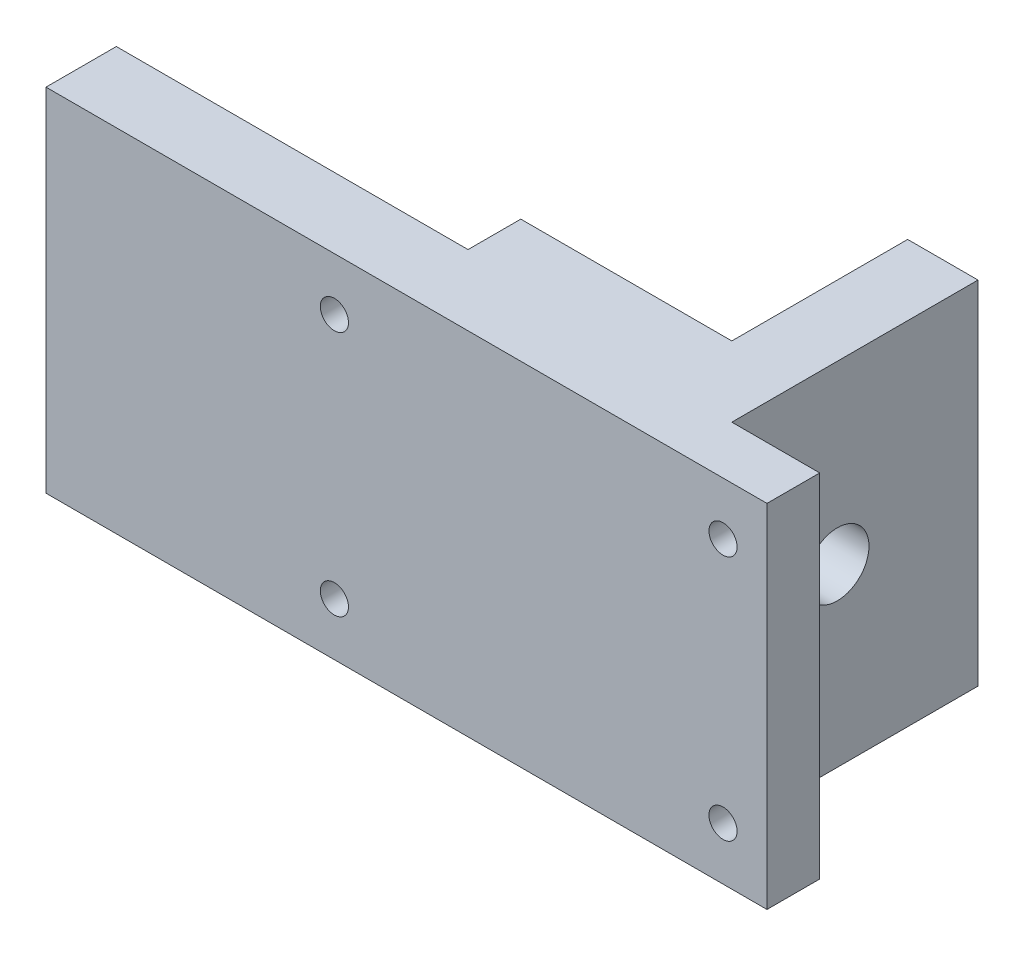
ISO-10303-21;
HEADER;
FILE_DESCRIPTION(('STEP AP214'),'2;1');
FILE_NAME('part.step','',(''),(''),'','','');
FILE_SCHEMA(('AUTOMOTIVE_DESIGN { 1 0 10303 214 1 1 1 1 }'));
ENDSEC;
DATA;
#1=APPLICATION_CONTEXT('core data for automotive mechanical design processes');
#2=APPLICATION_PROTOCOL_DEFINITION('international standard','automotive_design',2000,#1);
#3=PRODUCT_CONTEXT('',#1,'mechanical');
#4=PRODUCT('Part','Part','',(#3));
#5=PRODUCT_RELATED_PRODUCT_CATEGORY('part','',(#4));
#6=PRODUCT_DEFINITION_FORMATION('','',#4);
#7=PRODUCT_DEFINITION_CONTEXT('part definition',#1,'design');
#8=PRODUCT_DEFINITION('design','',#6,#7);
#9=PRODUCT_DEFINITION_SHAPE('','',#8);
#10=(LENGTH_UNIT() NAMED_UNIT(*) SI_UNIT(.MILLI.,.METRE.));
#11=(NAMED_UNIT(*) PLANE_ANGLE_UNIT() SI_UNIT($,.RADIAN.));
#12=(NAMED_UNIT(*) SI_UNIT($,.STERADIAN.) SOLID_ANGLE_UNIT());
#13=UNCERTAINTY_MEASURE_WITH_UNIT(LENGTH_MEASURE(1.E-05),#10,'distance_accuracy_value','');
#14=(GEOMETRIC_REPRESENTATION_CONTEXT(3) GLOBAL_UNCERTAINTY_ASSIGNED_CONTEXT((#13)) GLOBAL_UNIT_ASSIGNED_CONTEXT((#10,
#11,#12)) REPRESENTATION_CONTEXT('',''));
#15=CARTESIAN_POINT('',(0.,0.,0.));
#16=DIRECTION('',(0.,0.,1.));
#17=DIRECTION('',(1.,0.,0.));
#18=AXIS2_PLACEMENT_3D('',#15,#16,#17);
#19=CARTESIAN_POINT('',(0.,100.,-20.));
#20=DIRECTION('',(0.,0.,1.));
#21=DIRECTION('',(1.,0.,0.));
#22=AXIS2_PLACEMENT_3D('',#19,#20,#21);
#23=PLANE('',#22);
#24=CARTESIAN_POINT('',(-137.5,67.,-20.));
#25=DIRECTION('',(0.,0.,-1.));
#26=DIRECTION('',(-1.,0.,0.));
#27=AXIS2_PLACEMENT_3D('',#24,#25,#26);
#28=CIRCLE('',#27,2.99999999999999);
#29=CARTESIAN_POINT('',(-140.5,67.,-20.));
#30=VERTEX_POINT('',#29);
#31=EDGE_CURVE('E412',#30,#30,#28,.T.);
#32=ORIENTED_EDGE('',*,*,#31,.F.);
#33=EDGE_LOOP('',(#32));
#34=FACE_BOUND('',#33,.T.);
#35=CARTESIAN_POINT('',(-137.5,33.,-20.));
#36=DIRECTION('',(0.,0.,-1.));
#37=DIRECTION('',(-1.,0.,0.));
#38=AXIS2_PLACEMENT_3D('',#35,#36,#37);
#39=CIRCLE('',#38,2.99999999999999);
#40=CARTESIAN_POINT('',(-140.5,33.,-20.));
#41=VERTEX_POINT('',#40);
#42=EDGE_CURVE('E404',#41,#41,#39,.T.);
#43=ORIENTED_EDGE('',*,*,#42,.F.);
#44=EDGE_LOOP('',(#43));
#45=FACE_BOUND('',#44,.T.);
#46=CARTESIAN_POINT('',(-78.,15.,-20.));
#47=DIRECTION('',(0.,0.,-1.));
#48=DIRECTION('',(-1.,0.,0.));
#49=AXIS2_PLACEMENT_3D('',#46,#47,#48);
#50=CIRCLE('',#49,7.49999999999999);
#51=CARTESIAN_POINT('',(-85.5,15.,-20.));
#52=VERTEX_POINT('',#51);
#53=EDGE_CURVE('E428',#52,#52,#50,.T.);
#54=ORIENTED_EDGE('',*,*,#53,.F.);
#55=EDGE_LOOP('',(#54));
#56=FACE_BOUND('',#55,.T.);
#57=DIRECTION('',(0.,1.,0.));
#58=VECTOR('',#57,1.);
#59=CARTESIAN_POINT('',(-60.,29.,-20.));
#60=LINE('',#59,#58);
#61=CARTESIAN_POINT('',(-60.,0.,-20.));
#62=VERTEX_POINT('',#61);
#63=CARTESIAN_POINT('',(-60.,29.,-20.));
#64=VERTEX_POINT('',#63);
#65=EDGE_CURVE('E158',#62,#64,#60,.T.);
#66=ORIENTED_EDGE('',*,*,#65,.F.);
#67=DIRECTION('',(-1.,0.,0.));
#68=VECTOR('',#67,1.);
#69=CARTESIAN_POINT('',(0.,0.,-20.));
#70=LINE('',#69,#68);
#71=CARTESIAN_POINT('',(-160.,0.,-20.));
#72=VERTEX_POINT('',#71);
#73=EDGE_CURVE('E145',#62,#72,#70,.T.);
#74=ORIENTED_EDGE('',*,*,#73,.T.);
#75=DIRECTION('',(0.,-1.,0.));
#76=VECTOR('',#75,1.);
#77=CARTESIAN_POINT('',(-160.,100.,-20.));
#78=LINE('',#77,#76);
#79=CARTESIAN_POINT('',(-160.,100.,-20.));
#80=VERTEX_POINT('',#79);
#81=EDGE_CURVE('E224',#80,#72,#78,.T.);
#82=ORIENTED_EDGE('',*,*,#81,.F.);
#83=DIRECTION('',(-1.,0.,0.));
#84=VECTOR('',#83,1.);
#85=CARTESIAN_POINT('',(0.,100.,-20.));
#86=LINE('',#85,#84);
#87=CARTESIAN_POINT('',(-60.,100.,-20.));
#88=VERTEX_POINT('',#87);
#89=EDGE_CURVE('E222',#88,#80,#86,.T.);
#90=ORIENTED_EDGE('',*,*,#89,.F.);
#91=DIRECTION('',(0.,1.,0.));
#92=VECTOR('',#91,1.);
#93=CARTESIAN_POINT('',(-60.,71.,-20.));
#94=LINE('',#93,#92);
#95=CARTESIAN_POINT('',(-60.,71.,-20.));
#96=VERTEX_POINT('',#95);
#97=EDGE_CURVE('E191',#96,#88,#94,.T.);
#98=ORIENTED_EDGE('',*,*,#97,.F.);
#99=DIRECTION('',(-1.,0.,0.));
#100=VECTOR('',#99,1.);
#101=CARTESIAN_POINT('',(-60.,71.,-20.));
#102=LINE('',#101,#100);
#103=CARTESIAN_POINT('',(0.,71.,-20.));
#104=VERTEX_POINT('',#103);
#105=EDGE_CURVE('E163',#104,#96,#102,.T.);
#106=ORIENTED_EDGE('',*,*,#105,.F.);
#107=DIRECTION('',(0.,-1.,0.));
#108=VECTOR('',#107,1.);
#109=CARTESIAN_POINT('',(0.,100.,-20.));
#110=LINE('',#109,#108);
#111=CARTESIAN_POINT('',(0.,29.,-20.));
#112=VERTEX_POINT('',#111);
#113=EDGE_CURVE('E238',#104,#112,#110,.T.);
#114=ORIENTED_EDGE('',*,*,#113,.T.);
#115=DIRECTION('',(1.,0.,0.));
#116=VECTOR('',#115,1.);
#117=CARTESIAN_POINT('',(-60.,29.,-20.));
#118=LINE('',#117,#116);
#119=EDGE_CURVE('E65',#64,#112,#118,.T.);
#120=ORIENTED_EDGE('',*,*,#119,.F.);
#121=EDGE_LOOP('',(#66,#74,#82,#90,#98,#106,#114,#120));
#122=FACE_BOUND('',#121,.T.);
#123=CARTESIAN_POINT('',(-78.,85.,-20.));
#124=DIRECTION('',(0.,0.,-1.));
#125=DIRECTION('',(-1.,0.,0.));
#126=AXIS2_PLACEMENT_3D('',#123,#124,#125);
#127=CIRCLE('',#126,7.49999999999999);
#128=CARTESIAN_POINT('',(-85.5,85.,-20.));
#129=VERTEX_POINT('',#128);
#130=EDGE_CURVE('E411',#129,#129,#127,.T.);
#131=ORIENTED_EDGE('',*,*,#130,.F.);
#132=EDGE_LOOP('',(#131));
#133=FACE_BOUND('',#132,.T.);
#134=ADVANCED_FACE('F42',(#34,#45,#56,#122,#133),#23,.F.);
#135=CARTESIAN_POINT('',(0.,100.,-85.));
#136=DIRECTION('',(1.,0.,0.));
#137=DIRECTION('',(0.,0.,-1.));
#138=AXIS2_PLACEMENT_3D('',#135,#136,#137);
#139=PLANE('',#138);
#140=CARTESIAN_POINT('',(0.,50.,-45.));
#141=DIRECTION('',(1.,0.,0.));
#142=DIRECTION('',(0.,0.,-1.));
#143=AXIS2_PLACEMENT_3D('',#140,#141,#142);
#144=CIRCLE('',#143,9.);
#145=CARTESIAN_POINT('',(0.,50.,-54.));
#146=VERTEX_POINT('',#145);
#147=EDGE_CURVE('E400',#146,#146,#144,.T.);
#148=ORIENTED_EDGE('',*,*,#147,.T.);
#149=EDGE_LOOP('',(#148));
#150=FACE_BOUND('',#149,.T.);
#151=DIRECTION('',(0.,0.,1.));
#152=VECTOR('',#151,1.);
#153=CARTESIAN_POINT('',(0.,29.,-35.));
#154=LINE('',#153,#152);
#155=CARTESIAN_POINT('',(0.,29.,-35.));
#156=VERTEX_POINT('',#155);
#157=EDGE_CURVE('E170',#156,#112,#154,.T.);
#158=ORIENTED_EDGE('',*,*,#157,.T.);
#159=ORIENTED_EDGE('',*,*,#113,.F.);
#160=DIRECTION('',(0.,0.,1.));
#161=VECTOR('',#160,1.);
#162=CARTESIAN_POINT('',(0.,71.,-35.));
#163=LINE('',#162,#161);
#164=CARTESIAN_POINT('',(0.,71.,-35.));
#165=VERTEX_POINT('',#164);
#166=EDGE_CURVE('E205',#165,#104,#163,.T.);
#167=ORIENTED_EDGE('',*,*,#166,.F.);
#168=DIRECTION('',(0.,-1.,0.));
#169=VECTOR('',#168,1.);
#170=CARTESIAN_POINT('',(0.,71.,-35.));
#171=LINE('',#170,#169);
#172=CARTESIAN_POINT('',(0.,100.,-35.));
#173=VERTEX_POINT('',#172);
#174=EDGE_CURVE('E187',#173,#165,#171,.T.);
#175=ORIENTED_EDGE('',*,*,#174,.F.);
#176=DIRECTION('',(0.,0.,1.));
#177=VECTOR('',#176,1.);
#178=CARTESIAN_POINT('',(0.,100.,-85.));
#179=LINE('',#178,#177);
#180=CARTESIAN_POINT('',(0.,100.,-85.));
#181=VERTEX_POINT('',#180);
#182=EDGE_CURVE('E219',#181,#173,#179,.T.);
#183=ORIENTED_EDGE('',*,*,#182,.F.);
#184=DIRECTION('',(0.,-1.,0.));
#185=VECTOR('',#184,1.);
#186=CARTESIAN_POINT('',(0.,100.,-85.));
#187=LINE('',#186,#185);
#188=CARTESIAN_POINT('',(0.,0.,-85.));
#189=VERTEX_POINT('',#188);
#190=EDGE_CURVE('E240',#181,#189,#187,.T.);
#191=ORIENTED_EDGE('',*,*,#190,.T.);
#192=DIRECTION('',(0.,0.,1.));
#193=VECTOR('',#192,1.);
#194=CARTESIAN_POINT('',(0.,0.,-85.));
#195=LINE('',#194,#193);
#196=CARTESIAN_POINT('',(0.,0.,-35.));
#197=VERTEX_POINT('',#196);
#198=EDGE_CURVE('E156',#189,#197,#195,.T.);
#199=ORIENTED_EDGE('',*,*,#198,.T.);
#200=DIRECTION('',(0.,-1.,0.));
#201=VECTOR('',#200,1.);
#202=CARTESIAN_POINT('',(0.,29.,-35.));
#203=LINE('',#202,#201);
#204=EDGE_CURVE('E57',#156,#197,#203,.T.);
#205=ORIENTED_EDGE('',*,*,#204,.F.);
#206=EDGE_LOOP('',(#158,#159,#167,#175,#183,#191,#199,#205));
#207=FACE_BOUND('',#206,.T.);
#208=ADVANCED_FACE('F291',(#150,#207),#139,.F.);
#209=CARTESIAN_POINT('',(-160.,100.,-20.));
#210=DIRECTION('',(1.,0.,0.));
#211=DIRECTION('',(0.,0.,-1.));
#212=AXIS2_PLACEMENT_3D('',#209,#210,#211);
#213=PLANE('',#212);
#214=DIRECTION('',(0.,0.,1.));
#215=VECTOR('',#214,1.);
#216=CARTESIAN_POINT('',(-160.,0.,-20.));
#217=LINE('',#216,#215);
#218=CARTESIAN_POINT('',(-160.,0.,0.));
#219=VERTEX_POINT('',#218);
#220=EDGE_CURVE('E152',#72,#219,#217,.T.);
#221=ORIENTED_EDGE('',*,*,#220,.T.);
#222=DIRECTION('',(0.,-1.,0.));
#223=VECTOR('',#222,1.);
#224=CARTESIAN_POINT('',(-160.,100.,0.));
#225=LINE('',#224,#223);
#226=CARTESIAN_POINT('',(-160.,100.,0.));
#227=VERTEX_POINT('',#226);
#228=EDGE_CURVE('E11',#227,#219,#225,.T.);
#229=ORIENTED_EDGE('',*,*,#228,.F.);
#230=DIRECTION('',(0.,0.,1.));
#231=VECTOR('',#230,1.);
#232=CARTESIAN_POINT('',(-160.,100.,-20.));
#233=LINE('',#232,#231);
#234=EDGE_CURVE('E155',#80,#227,#233,.T.);
#235=ORIENTED_EDGE('',*,*,#234,.F.);
#236=ORIENTED_EDGE('',*,*,#81,.T.);
#237=EDGE_LOOP('',(#221,#229,#235,#236));
#238=FACE_BOUND('',#237,.T.);
#239=ADVANCED_FACE('F44',(#238),#213,.F.);
#240=CARTESIAN_POINT('',(-160.,100.,0.));
#241=DIRECTION('',(0.,0.,-1.));
#242=DIRECTION('',(-1.,0.,0.));
#243=AXIS2_PLACEMENT_3D('',#240,#241,#242);
#244=PLANE('',#243);
#245=CARTESIAN_POINT('',(-78.,85.,0.));
#246=DIRECTION('',(0.,0.,-1.));
#247=DIRECTION('',(-1.,0.,0.));
#248=AXIS2_PLACEMENT_3D('',#245,#246,#247);
#249=CIRCLE('',#248,4.);
#250=CARTESIAN_POINT('',(-82.,85.,0.));
#251=VERTEX_POINT('',#250);
#252=EDGE_CURVE('E425',#251,#251,#249,.T.);
#253=ORIENTED_EDGE('',*,*,#252,.T.);
#254=EDGE_LOOP('',(#253));
#255=FACE_BOUND('',#254,.T.);
#256=CARTESIAN_POINT('',(-78.,15.,0.));
#257=DIRECTION('',(0.,0.,-1.));
#258=DIRECTION('',(-1.,0.,0.));
#259=AXIS2_PLACEMENT_3D('',#256,#257,#258);
#260=CIRCLE('',#259,4.);
#261=CARTESIAN_POINT('',(-82.,15.,0.));
#262=VERTEX_POINT('',#261);
#263=EDGE_CURVE('E437',#262,#262,#260,.T.);
#264=ORIENTED_EDGE('',*,*,#263,.T.);
#265=EDGE_LOOP('',(#264));
#266=FACE_BOUND('',#265,.T.);
#267=CARTESIAN_POINT('',(32.5,85.,0.));
#268=DIRECTION('',(0.,0.,-1.));
#269=DIRECTION('',(-1.,0.,0.));
#270=AXIS2_PLACEMENT_3D('',#267,#268,#269);
#271=CIRCLE('',#270,4.);
#272=CARTESIAN_POINT('',(28.5,85.,0.));
#273=VERTEX_POINT('',#272);
#274=EDGE_CURVE('E168',#273,#273,#271,.T.);
#275=ORIENTED_EDGE('',*,*,#274,.T.);
#276=EDGE_LOOP('',(#275));
#277=FACE_BOUND('',#276,.T.);
#278=CARTESIAN_POINT('',(32.5,15.,0.));
#279=DIRECTION('',(0.,0.,-1.));
#280=DIRECTION('',(-1.,0.,0.));
#281=AXIS2_PLACEMENT_3D('',#278,#279,#280);
#282=CIRCLE('',#281,4.);
#283=CARTESIAN_POINT('',(28.5,15.,0.));
#284=VERTEX_POINT('',#283);
#285=EDGE_CURVE('E176',#284,#284,#282,.T.);
#286=ORIENTED_EDGE('',*,*,#285,.T.);
#287=EDGE_LOOP('',(#286));
#288=FACE_BOUND('',#287,.T.);
#289=DIRECTION('',(1.,0.,0.));
#290=VECTOR('',#289,1.);
#291=CARTESIAN_POINT('',(-160.,0.,0.));
#292=LINE('',#291,#290);
#293=CARTESIAN_POINT('',(45.,0.,0.));
#294=VERTEX_POINT('',#293);
#295=EDGE_CURVE('E226',#219,#294,#292,.T.);
#296=ORIENTED_EDGE('',*,*,#295,.T.);
#297=DIRECTION('',(0.,-1.,0.));
#298=VECTOR('',#297,1.);
#299=CARTESIAN_POINT('',(45.,100.,0.));
#300=LINE('',#299,#298);
#301=CARTESIAN_POINT('',(45.,100.,0.));
#302=VERTEX_POINT('',#301);
#303=EDGE_CURVE('E50',#302,#294,#300,.T.);
#304=ORIENTED_EDGE('',*,*,#303,.F.);
#305=DIRECTION('',(1.,0.,0.));
#306=VECTOR('',#305,1.);
#307=CARTESIAN_POINT('',(-160.,100.,0.));
#308=LINE('',#307,#306);
#309=EDGE_CURVE('E209',#227,#302,#308,.T.);
#310=ORIENTED_EDGE('',*,*,#309,.F.);
#311=ORIENTED_EDGE('',*,*,#228,.T.);
#312=EDGE_LOOP('',(#296,#304,#310,#311));
#313=FACE_BOUND('',#312,.T.);
#314=ADVANCED_FACE('F276',(#255,#266,#277,#288,#313),#244,.F.);
#315=CARTESIAN_POINT('',(45.,100.,0.));
#316=DIRECTION('',(-1.,0.,0.));
#317=DIRECTION('',(0.,0.,1.));
#318=AXIS2_PLACEMENT_3D('',#315,#316,#317);
#319=PLANE('',#318);
#320=DIRECTION('',(0.,0.,-1.));
#321=VECTOR('',#320,1.);
#322=CARTESIAN_POINT('',(45.,0.,0.));
#323=LINE('',#322,#321);
#324=CARTESIAN_POINT('',(45.,0.,-15.));
#325=VERTEX_POINT('',#324);
#326=EDGE_CURVE('E228',#294,#325,#323,.T.);
#327=ORIENTED_EDGE('',*,*,#326,.T.);
#328=DIRECTION('',(0.,-1.,0.));
#329=VECTOR('',#328,1.);
#330=CARTESIAN_POINT('',(45.,100.,-15.));
#331=LINE('',#330,#329);
#332=CARTESIAN_POINT('',(45.,100.,-15.));
#333=VERTEX_POINT('',#332);
#334=EDGE_CURVE('E249',#333,#325,#331,.T.);
#335=ORIENTED_EDGE('',*,*,#334,.F.);
#336=DIRECTION('',(0.,0.,-1.));
#337=VECTOR('',#336,1.);
#338=CARTESIAN_POINT('',(45.,100.,0.));
#339=LINE('',#338,#337);
#340=EDGE_CURVE('E211',#302,#333,#339,.T.);
#341=ORIENTED_EDGE('',*,*,#340,.F.);
#342=ORIENTED_EDGE('',*,*,#303,.T.);
#343=EDGE_LOOP('',(#327,#335,#341,#342));
#344=FACE_BOUND('',#343,.T.);
#345=ADVANCED_FACE('F256',(#344),#319,.F.);
#346=CARTESIAN_POINT('',(45.,100.,-15.));
#347=DIRECTION('',(0.,0.,1.));
#348=DIRECTION('',(1.,0.,0.));
#349=AXIS2_PLACEMENT_3D('',#346,#347,#348);
#350=PLANE('',#349);
#351=CARTESIAN_POINT('',(32.5,85.,-15.));
#352=DIRECTION('',(0.,0.,-1.));
#353=DIRECTION('',(-1.,0.,0.));
#354=AXIS2_PLACEMENT_3D('',#351,#352,#353);
#355=CIRCLE('',#354,4.);
#356=CARTESIAN_POINT('',(28.5,85.,-15.));
#357=VERTEX_POINT('',#356);
#358=EDGE_CURVE('E173',#357,#357,#355,.T.);
#359=ORIENTED_EDGE('',*,*,#358,.F.);
#360=EDGE_LOOP('',(#359));
#361=FACE_BOUND('',#360,.T.);
#362=CARTESIAN_POINT('',(32.5,15.,-15.));
#363=DIRECTION('',(0.,0.,-1.));
#364=DIRECTION('',(-1.,0.,0.));
#365=AXIS2_PLACEMENT_3D('',#362,#363,#364);
#366=CIRCLE('',#365,4.);
#367=CARTESIAN_POINT('',(28.5,15.,-15.));
#368=VERTEX_POINT('',#367);
#369=EDGE_CURVE('E441',#368,#368,#366,.T.);
#370=ORIENTED_EDGE('',*,*,#369,.F.);
#371=EDGE_LOOP('',(#370));
#372=FACE_BOUND('',#371,.T.);
#373=DIRECTION('',(-1.,0.,0.));
#374=VECTOR('',#373,1.);
#375=CARTESIAN_POINT('',(45.,0.,-15.));
#376=LINE('',#375,#374);
#377=CARTESIAN_POINT('',(20.,0.,-15.));
#378=VERTEX_POINT('',#377);
#379=EDGE_CURVE('E230',#325,#378,#376,.T.);
#380=ORIENTED_EDGE('',*,*,#379,.T.);
#381=DIRECTION('',(0.,-1.,0.));
#382=VECTOR('',#381,1.);
#383=CARTESIAN_POINT('',(20.,100.,-15.));
#384=LINE('',#383,#382);
#385=CARTESIAN_POINT('',(20.,100.,-15.));
#386=VERTEX_POINT('',#385);
#387=EDGE_CURVE('E246',#386,#378,#384,.T.);
#388=ORIENTED_EDGE('',*,*,#387,.F.);
#389=DIRECTION('',(-1.,0.,0.));
#390=VECTOR('',#389,1.);
#391=CARTESIAN_POINT('',(45.,100.,-15.));
#392=LINE('',#391,#390);
#393=EDGE_CURVE('E213',#333,#386,#392,.T.);
#394=ORIENTED_EDGE('',*,*,#393,.F.);
#395=ORIENTED_EDGE('',*,*,#334,.T.);
#396=EDGE_LOOP('',(#380,#388,#394,#395));
#397=FACE_BOUND('',#396,.T.);
#398=ADVANCED_FACE('F264',(#361,#372,#397),#350,.F.);
#399=CARTESIAN_POINT('',(20.,100.,-15.));
#400=DIRECTION('',(-1.,0.,0.));
#401=DIRECTION('',(0.,0.,1.));
#402=AXIS2_PLACEMENT_3D('',#399,#400,#401);
#403=PLANE('',#402);
#404=CARTESIAN_POINT('',(20.,50.,-45.));
#405=DIRECTION('',(1.,0.,0.));
#406=DIRECTION('',(0.,0.,-1.));
#407=AXIS2_PLACEMENT_3D('',#404,#405,#406);
#408=CIRCLE('',#407,9.);
#409=CARTESIAN_POINT('',(20.,50.,-54.));
#410=VERTEX_POINT('',#409);
#411=EDGE_CURVE('E397',#410,#410,#408,.T.);
#412=ORIENTED_EDGE('',*,*,#411,.F.);
#413=EDGE_LOOP('',(#412));
#414=FACE_BOUND('',#413,.T.);
#415=DIRECTION('',(0.,0.,-1.));
#416=VECTOR('',#415,1.);
#417=CARTESIAN_POINT('',(20.,0.,-15.));
#418=LINE('',#417,#416);
#419=CARTESIAN_POINT('',(20.,0.,-85.));
#420=VERTEX_POINT('',#419);
#421=EDGE_CURVE('E232',#378,#420,#418,.T.);
#422=ORIENTED_EDGE('',*,*,#421,.T.);
#423=DIRECTION('',(0.,-1.,0.));
#424=VECTOR('',#423,1.);
#425=CARTESIAN_POINT('',(20.,100.,-85.));
#426=LINE('',#425,#424);
#427=CARTESIAN_POINT('',(20.,100.,-85.));
#428=VERTEX_POINT('',#427);
#429=EDGE_CURVE('E243',#428,#420,#426,.T.);
#430=ORIENTED_EDGE('',*,*,#429,.F.);
#431=DIRECTION('',(0.,0.,-1.));
#432=VECTOR('',#431,1.);
#433=CARTESIAN_POINT('',(20.,100.,-15.));
#434=LINE('',#433,#432);
#435=EDGE_CURVE('E215',#386,#428,#434,.T.);
#436=ORIENTED_EDGE('',*,*,#435,.F.);
#437=ORIENTED_EDGE('',*,*,#387,.T.);
#438=EDGE_LOOP('',(#422,#430,#436,#437));
#439=FACE_BOUND('',#438,.T.);
#440=ADVANCED_FACE('F268',(#414,#439),#403,.F.);
#441=CARTESIAN_POINT('',(20.,100.,-85.));
#442=DIRECTION('',(0.,0.,1.));
#443=DIRECTION('',(1.,0.,0.));
#444=AXIS2_PLACEMENT_3D('',#441,#442,#443);
#445=PLANE('',#444);
#446=DIRECTION('',(-1.,0.,0.));
#447=VECTOR('',#446,1.);
#448=CARTESIAN_POINT('',(20.,0.,-85.));
#449=LINE('',#448,#447);
#450=EDGE_CURVE('E234',#420,#189,#449,.T.);
#451=ORIENTED_EDGE('',*,*,#450,.T.);
#452=ORIENTED_EDGE('',*,*,#190,.F.);
#453=DIRECTION('',(-1.,0.,0.));
#454=VECTOR('',#453,1.);
#455=CARTESIAN_POINT('',(20.,100.,-85.));
#456=LINE('',#455,#454);
#457=EDGE_CURVE('E217',#428,#181,#456,.T.);
#458=ORIENTED_EDGE('',*,*,#457,.F.);
#459=ORIENTED_EDGE('',*,*,#429,.T.);
#460=EDGE_LOOP('',(#451,#452,#458,#459));
#461=FACE_BOUND('',#460,.T.);
#462=ADVANCED_FACE('F302',(#461),#445,.F.);
#463=CARTESIAN_POINT('',(0.,100.,0.));
#464=DIRECTION('',(0.,1.,0.));
#465=DIRECTION('',(0.,0.,1.));
#466=AXIS2_PLACEMENT_3D('',#463,#464,#465);
#467=PLANE('',#466);
#468=ORIENTED_EDGE('',*,*,#234,.T.);
#469=ORIENTED_EDGE('',*,*,#309,.T.);
#470=ORIENTED_EDGE('',*,*,#340,.T.);
#471=ORIENTED_EDGE('',*,*,#393,.T.);
#472=ORIENTED_EDGE('',*,*,#435,.T.);
#473=ORIENTED_EDGE('',*,*,#457,.T.);
#474=ORIENTED_EDGE('',*,*,#182,.T.);
#475=DIRECTION('',(1.,0.,0.));
#476=VECTOR('',#475,1.);
#477=CARTESIAN_POINT('',(-60.,100.,-35.));
#478=LINE('',#477,#476);
#479=CARTESIAN_POINT('',(-60.,100.,-35.));
#480=VERTEX_POINT('',#479);
#481=EDGE_CURVE('E195',#480,#173,#478,.T.);
#482=ORIENTED_EDGE('',*,*,#481,.F.);
#483=DIRECTION('',(0.,0.,1.));
#484=VECTOR('',#483,1.);
#485=CARTESIAN_POINT('',(-60.,100.,-35.));
#486=LINE('',#485,#484);
#487=EDGE_CURVE('E197',#480,#88,#486,.T.);
#488=ORIENTED_EDGE('',*,*,#487,.T.);
#489=ORIENTED_EDGE('',*,*,#89,.T.);
#490=EDGE_LOOP('',(#468,#469,#470,#471,#472,#473,#474,#482,#488,#489));
#491=FACE_BOUND('',#490,.T.);
#492=ADVANCED_FACE('F272',(#491),#467,.T.);
#493=CARTESIAN_POINT('',(0.,0.,0.));
#494=DIRECTION('',(0.,1.,0.));
#495=DIRECTION('',(0.,0.,1.));
#496=AXIS2_PLACEMENT_3D('',#493,#494,#495);
#497=PLANE('',#496);
#498=ORIENTED_EDGE('',*,*,#220,.F.);
#499=ORIENTED_EDGE('',*,*,#73,.F.);
#500=DIRECTION('',(0.,0.,1.));
#501=VECTOR('',#500,1.);
#502=CARTESIAN_POINT('',(-60.,0.,-35.));
#503=LINE('',#502,#501);
#504=CARTESIAN_POINT('',(-60.,0.,-35.));
#505=VERTEX_POINT('',#504);
#506=EDGE_CURVE('E149',#505,#62,#503,.T.);
#507=ORIENTED_EDGE('',*,*,#506,.F.);
#508=DIRECTION('',(-1.,0.,0.));
#509=VECTOR('',#508,1.);
#510=CARTESIAN_POINT('',(-60.,0.,-35.));
#511=LINE('',#510,#509);
#512=EDGE_CURVE('E184',#197,#505,#511,.T.);
#513=ORIENTED_EDGE('',*,*,#512,.F.);
#514=ORIENTED_EDGE('',*,*,#198,.F.);
#515=ORIENTED_EDGE('',*,*,#450,.F.);
#516=ORIENTED_EDGE('',*,*,#421,.F.);
#517=ORIENTED_EDGE('',*,*,#379,.F.);
#518=ORIENTED_EDGE('',*,*,#326,.F.);
#519=ORIENTED_EDGE('',*,*,#295,.F.);
#520=EDGE_LOOP('',(#498,#499,#507,#513,#514,#515,#516,#517,#518,#519));
#521=FACE_BOUND('',#520,.T.);
#522=ADVANCED_FACE('F146',(#521),#497,.F.);
#523=CARTESIAN_POINT('',(-60.,71.,-35.));
#524=DIRECTION('',(0.,1.,0.));
#525=DIRECTION('',(-1.,0.,0.));
#526=AXIS2_PLACEMENT_3D('',#523,#524,#525);
#527=PLANE('',#526);
#528=ORIENTED_EDGE('',*,*,#105,.T.);
#529=DIRECTION('',(0.,0.,1.));
#530=VECTOR('',#529,1.);
#531=CARTESIAN_POINT('',(-60.,71.,-35.));
#532=LINE('',#531,#530);
#533=CARTESIAN_POINT('',(-60.,71.,-35.));
#534=VERTEX_POINT('',#533);
#535=EDGE_CURVE('E202',#534,#96,#532,.T.);
#536=ORIENTED_EDGE('',*,*,#535,.F.);
#537=DIRECTION('',(-1.,0.,0.));
#538=VECTOR('',#537,1.);
#539=CARTESIAN_POINT('',(-60.,71.,-35.));
#540=LINE('',#539,#538);
#541=EDGE_CURVE('E190',#165,#534,#540,.T.);
#542=ORIENTED_EDGE('',*,*,#541,.F.);
#543=ORIENTED_EDGE('',*,*,#166,.T.);
#544=EDGE_LOOP('',(#528,#536,#542,#543));
#545=FACE_BOUND('',#544,.T.);
#546=ADVANCED_FACE('F288',(#545),#527,.F.);
#547=CARTESIAN_POINT('',(-60.,71.,-35.));
#548=DIRECTION('',(1.,0.,0.));
#549=DIRECTION('',(0.,0.,-1.));
#550=AXIS2_PLACEMENT_3D('',#547,#548,#549);
#551=PLANE('',#550);
#552=ORIENTED_EDGE('',*,*,#97,.T.);
#553=ORIENTED_EDGE('',*,*,#487,.F.);
#554=DIRECTION('',(0.,1.,0.));
#555=VECTOR('',#554,1.);
#556=CARTESIAN_POINT('',(-60.,71.,-35.));
#557=LINE('',#556,#555);
#558=EDGE_CURVE('E193',#534,#480,#557,.T.);
#559=ORIENTED_EDGE('',*,*,#558,.F.);
#560=ORIENTED_EDGE('',*,*,#535,.T.);
#561=EDGE_LOOP('',(#552,#553,#559,#560));
#562=FACE_BOUND('',#561,.T.);
#563=ADVANCED_FACE('F285',(#562),#551,.F.);
#564=CARTESIAN_POINT('',(0.,0.,-35.));
#565=DIRECTION('',(0.,0.,-1.));
#566=DIRECTION('',(-1.,0.,0.));
#567=AXIS2_PLACEMENT_3D('',#564,#565,#566);
#568=PLANE('',#567);
#569=ORIENTED_EDGE('',*,*,#174,.T.);
#570=ORIENTED_EDGE('',*,*,#541,.T.);
#571=ORIENTED_EDGE('',*,*,#558,.T.);
#572=ORIENTED_EDGE('',*,*,#481,.T.);
#573=EDGE_LOOP('',(#569,#570,#571,#572));
#574=FACE_BOUND('',#573,.T.);
#575=ADVANCED_FACE('F331',(#574),#568,.T.);
#576=CARTESIAN_POINT('',(-60.,29.,-35.));
#577=DIRECTION('',(1.,0.,0.));
#578=DIRECTION('',(0.,1.,0.));
#579=AXIS2_PLACEMENT_3D('',#576,#577,#578);
#580=PLANE('',#579);
#581=ORIENTED_EDGE('',*,*,#65,.T.);
#582=DIRECTION('',(0.,0.,1.));
#583=VECTOR('',#582,1.);
#584=CARTESIAN_POINT('',(-60.,29.,-35.));
#585=LINE('',#584,#583);
#586=CARTESIAN_POINT('',(-60.,29.,-35.));
#587=VERTEX_POINT('',#586);
#588=EDGE_CURVE('E167',#587,#64,#585,.T.);
#589=ORIENTED_EDGE('',*,*,#588,.F.);
#590=DIRECTION('',(0.,1.,0.));
#591=VECTOR('',#590,1.);
#592=CARTESIAN_POINT('',(-60.,29.,-35.));
#593=LINE('',#592,#591);
#594=EDGE_CURVE('E166',#505,#587,#593,.T.);
#595=ORIENTED_EDGE('',*,*,#594,.F.);
#596=ORIENTED_EDGE('',*,*,#506,.T.);
#597=EDGE_LOOP('',(#581,#589,#595,#596));
#598=FACE_BOUND('',#597,.T.);
#599=ADVANCED_FACE('F165',(#598),#580,.F.);
#600=CARTESIAN_POINT('',(-60.,29.,-35.));
#601=DIRECTION('',(0.,-1.,0.));
#602=DIRECTION('',(1.,0.,0.));
#603=AXIS2_PLACEMENT_3D('',#600,#601,#602);
#604=PLANE('',#603);
#605=ORIENTED_EDGE('',*,*,#119,.T.);
#606=ORIENTED_EDGE('',*,*,#157,.F.);
#607=DIRECTION('',(1.,0.,0.));
#608=VECTOR('',#607,1.);
#609=CARTESIAN_POINT('',(-60.,29.,-35.));
#610=LINE('',#609,#608);
#611=EDGE_CURVE('E180',#587,#156,#610,.T.);
#612=ORIENTED_EDGE('',*,*,#611,.F.);
#613=ORIENTED_EDGE('',*,*,#588,.T.);
#614=EDGE_LOOP('',(#605,#606,#612,#613));
#615=FACE_BOUND('',#614,.T.);
#616=ADVANCED_FACE('F296',(#615),#604,.F.);
#617=CARTESIAN_POINT('',(0.,0.,-35.));
#618=DIRECTION('',(0.,0.,1.));
#619=DIRECTION('',(1.,0.,0.));
#620=AXIS2_PLACEMENT_3D('',#617,#618,#619);
#621=PLANE('',#620);
#622=ORIENTED_EDGE('',*,*,#204,.T.);
#623=ORIENTED_EDGE('',*,*,#512,.T.);
#624=ORIENTED_EDGE('',*,*,#594,.T.);
#625=ORIENTED_EDGE('',*,*,#611,.T.);
#626=EDGE_LOOP('',(#622,#623,#624,#625));
#627=FACE_BOUND('',#626,.T.);
#628=ADVANCED_FACE('F298',(#627),#621,.F.);
#629=CARTESIAN_POINT('',(32.5,15.,0.));
#630=DIRECTION('',(0.,0.,-1.));
#631=DIRECTION('',(-1.,0.,0.));
#632=AXIS2_PLACEMENT_3D('',#629,#630,#631);
#633=CYLINDRICAL_SURFACE('',#632,4.);
#634=ORIENTED_EDGE('',*,*,#285,.F.);
#635=EDGE_LOOP('',(#634));
#636=FACE_BOUND('',#635,.T.);
#637=ORIENTED_EDGE('',*,*,#369,.T.);
#638=EDGE_LOOP('',(#637));
#639=FACE_BOUND('',#638,.T.);
#640=ADVANCED_FACE('F337',(#636,#639),#633,.F.);
#641=CARTESIAN_POINT('',(32.5,85.,0.));
#642=DIRECTION('',(0.,0.,-1.));
#643=DIRECTION('',(-1.,0.,0.));
#644=AXIS2_PLACEMENT_3D('',#641,#642,#643);
#645=CYLINDRICAL_SURFACE('',#644,4.);
#646=ORIENTED_EDGE('',*,*,#274,.F.);
#647=EDGE_LOOP('',(#646));
#648=FACE_BOUND('',#647,.T.);
#649=ORIENTED_EDGE('',*,*,#358,.T.);
#650=EDGE_LOOP('',(#649));
#651=FACE_BOUND('',#650,.T.);
#652=ADVANCED_FACE('F344',(#648,#651),#645,.F.);
#653=CARTESIAN_POINT('',(-78.,15.,-20.));
#654=DIRECTION('',(0.,0.,-1.));
#655=DIRECTION('',(-1.,0.,0.));
#656=AXIS2_PLACEMENT_3D('',#653,#654,#655);
#657=CYLINDRICAL_SURFACE('',#656,4.);
#658=ORIENTED_EDGE('',*,*,#263,.F.);
#659=EDGE_LOOP('',(#658));
#660=FACE_BOUND('',#659,.T.);
#661=CARTESIAN_POINT('',(-78.,15.,-12.8969878334036));
#662=DIRECTION('',(0.,0.,-1.));
#663=DIRECTION('',(-1.,0.,0.));
#664=AXIS2_PLACEMENT_3D('',#661,#662,#663);
#665=CIRCLE('',#664,4.);
#666=CARTESIAN_POINT('',(-82.,15.,-12.8969878334036));
#667=VERTEX_POINT('',#666);
#668=EDGE_CURVE('E434',#667,#667,#665,.T.);
#669=ORIENTED_EDGE('',*,*,#668,.T.);
#670=EDGE_LOOP('',(#669));
#671=FACE_BOUND('',#670,.T.);
#672=ADVANCED_FACE('F348',(#660,#671),#657,.F.);
#673=CARTESIAN_POINT('',(-78.,15.,-15.));
#674=DIRECTION('',(0.,0.,-1.));
#675=DIRECTION('',(-1.,0.,0.));
#676=AXIS2_PLACEMENT_3D('',#673,#674,#675);
#677=CONICAL_SURFACE('',#676,7.49999999999999,1.02974425867666);
#678=ORIENTED_EDGE('',*,*,#668,.F.);
#679=EDGE_LOOP('',(#678));
#680=FACE_BOUND('',#679,.T.);
#681=CARTESIAN_POINT('',(-78.,15.,-15.));
#682=DIRECTION('',(0.,0.,-1.));
#683=DIRECTION('',(-1.,0.,0.));
#684=AXIS2_PLACEMENT_3D('',#681,#682,#683);
#685=CIRCLE('',#684,7.49999999999999);
#686=CARTESIAN_POINT('',(-85.5,15.,-15.));
#687=VERTEX_POINT('',#686);
#688=EDGE_CURVE('E431',#687,#687,#685,.T.);
#689=ORIENTED_EDGE('',*,*,#688,.T.);
#690=EDGE_LOOP('',(#689));
#691=FACE_BOUND('',#690,.T.);
#692=ADVANCED_FACE('F352',(#680,#691),#677,.F.);
#693=CARTESIAN_POINT('',(-78.,15.,-20.));
#694=DIRECTION('',(0.,0.,-1.));
#695=DIRECTION('',(-1.,0.,0.));
#696=AXIS2_PLACEMENT_3D('',#693,#694,#695);
#697=CYLINDRICAL_SURFACE('',#696,7.49999999999999);
#698=ORIENTED_EDGE('',*,*,#688,.F.);
#699=EDGE_LOOP('',(#698));
#700=FACE_BOUND('',#699,.T.);
#701=ORIENTED_EDGE('',*,*,#53,.T.);
#702=EDGE_LOOP('',(#701));
#703=FACE_BOUND('',#702,.T.);
#704=ADVANCED_FACE('F356',(#700,#703),#697,.F.);
#705=CARTESIAN_POINT('',(-78.,85.,-20.));
#706=DIRECTION('',(0.,0.,-1.));
#707=DIRECTION('',(-1.,0.,0.));
#708=AXIS2_PLACEMENT_3D('',#705,#706,#707);
#709=CYLINDRICAL_SURFACE('',#708,4.);
#710=ORIENTED_EDGE('',*,*,#252,.F.);
#711=EDGE_LOOP('',(#710));
#712=FACE_BOUND('',#711,.T.);
#713=CARTESIAN_POINT('',(-78.,85.,-12.8969878334036));
#714=DIRECTION('',(0.,0.,-1.));
#715=DIRECTION('',(-1.,0.,0.));
#716=AXIS2_PLACEMENT_3D('',#713,#714,#715);
#717=CIRCLE('',#716,4.);
#718=CARTESIAN_POINT('',(-82.,85.,-12.8969878334036));
#719=VERTEX_POINT('',#718);
#720=EDGE_CURVE('E422',#719,#719,#717,.T.);
#721=ORIENTED_EDGE('',*,*,#720,.T.);
#722=EDGE_LOOP('',(#721));
#723=FACE_BOUND('',#722,.T.);
#724=ADVANCED_FACE('F360',(#712,#723),#709,.F.);
#725=CARTESIAN_POINT('',(-78.,85.,-15.));
#726=DIRECTION('',(0.,0.,-1.));
#727=DIRECTION('',(-1.,0.,0.));
#728=AXIS2_PLACEMENT_3D('',#725,#726,#727);
#729=CONICAL_SURFACE('',#728,7.49999999999999,1.02974425867666);
#730=ORIENTED_EDGE('',*,*,#720,.F.);
#731=EDGE_LOOP('',(#730));
#732=FACE_BOUND('',#731,.T.);
#733=CARTESIAN_POINT('',(-78.,85.,-15.));
#734=DIRECTION('',(0.,0.,-1.));
#735=DIRECTION('',(-1.,0.,0.));
#736=AXIS2_PLACEMENT_3D('',#733,#734,#735);
#737=CIRCLE('',#736,7.49999999999999);
#738=CARTESIAN_POINT('',(-85.5,85.,-15.));
#739=VERTEX_POINT('',#738);
#740=EDGE_CURVE('E419',#739,#739,#737,.T.);
#741=ORIENTED_EDGE('',*,*,#740,.T.);
#742=EDGE_LOOP('',(#741));
#743=FACE_BOUND('',#742,.T.);
#744=ADVANCED_FACE('F364',(#732,#743),#729,.F.);
#745=CARTESIAN_POINT('',(-78.,85.,-20.));
#746=DIRECTION('',(0.,0.,-1.));
#747=DIRECTION('',(-1.,0.,0.));
#748=AXIS2_PLACEMENT_3D('',#745,#746,#747);
#749=CYLINDRICAL_SURFACE('',#748,7.49999999999999);
#750=ORIENTED_EDGE('',*,*,#740,.F.);
#751=EDGE_LOOP('',(#750));
#752=FACE_BOUND('',#751,.T.);
#753=ORIENTED_EDGE('',*,*,#130,.T.);
#754=EDGE_LOOP('',(#753));
#755=FACE_BOUND('',#754,.T.);
#756=ADVANCED_FACE('F368',(#752,#755),#749,.F.);
#757=CARTESIAN_POINT('',(-137.5,33.,-5.));
#758=DIRECTION('',(0.,0.,-1.));
#759=DIRECTION('',(-1.,0.,0.));
#760=AXIS2_PLACEMENT_3D('',#757,#758,#759);
#761=CYLINDRICAL_SURFACE('',#760,2.99999999999999);
#762=CARTESIAN_POINT('',(-137.5,33.,-5.));
#763=DIRECTION('',(0.,0.,-1.));
#764=DIRECTION('',(-1.,0.,0.));
#765=AXIS2_PLACEMENT_3D('',#762,#763,#764);
#766=CIRCLE('',#765,2.99999999999999);
#767=CARTESIAN_POINT('',(-140.5,33.,-5.));
#768=VERTEX_POINT('',#767);
#769=EDGE_CURVE('E401',#768,#768,#766,.T.);
#770=ORIENTED_EDGE('',*,*,#769,.F.);
#771=EDGE_LOOP('',(#770));
#772=FACE_BOUND('',#771,.T.);
#773=ORIENTED_EDGE('',*,*,#42,.T.);
#774=EDGE_LOOP('',(#773));
#775=FACE_BOUND('',#774,.T.);
#776=ADVANCED_FACE('F372',(#772,#775),#761,.F.);
#777=CARTESIAN_POINT('',(-137.5,33.,-5.));
#778=DIRECTION('',(0.,0.,-1.));
#779=DIRECTION('',(-1.,0.,0.));
#780=AXIS2_PLACEMENT_3D('',#777,#778,#779);
#781=PLANE('',#780);
#782=ORIENTED_EDGE('',*,*,#769,.T.);
#783=EDGE_LOOP('',(#782));
#784=FACE_BOUND('',#783,.T.);
#785=ADVANCED_FACE('F374',(#784),#781,.T.);
#786=CARTESIAN_POINT('',(-137.5,67.,-5.));
#787=DIRECTION('',(0.,0.,-1.));
#788=DIRECTION('',(-1.,0.,0.));
#789=AXIS2_PLACEMENT_3D('',#786,#787,#788);
#790=CYLINDRICAL_SURFACE('',#789,2.99999999999999);
#791=CARTESIAN_POINT('',(-137.5,67.,-5.));
#792=DIRECTION('',(0.,0.,-1.));
#793=DIRECTION('',(-1.,0.,0.));
#794=AXIS2_PLACEMENT_3D('',#791,#792,#793);
#795=CIRCLE('',#794,2.99999999999999);
#796=CARTESIAN_POINT('',(-140.5,67.,-5.));
#797=VERTEX_POINT('',#796);
#798=EDGE_CURVE('E408',#797,#797,#795,.T.);
#799=ORIENTED_EDGE('',*,*,#798,.F.);
#800=EDGE_LOOP('',(#799));
#801=FACE_BOUND('',#800,.T.);
#802=ORIENTED_EDGE('',*,*,#31,.T.);
#803=EDGE_LOOP('',(#802));
#804=FACE_BOUND('',#803,.T.);
#805=ADVANCED_FACE('F377',(#801,#804),#790,.F.);
#806=CARTESIAN_POINT('',(-137.5,67.,-5.));
#807=DIRECTION('',(0.,0.,-1.));
#808=DIRECTION('',(-1.,0.,0.));
#809=AXIS2_PLACEMENT_3D('',#806,#807,#808);
#810=PLANE('',#809);
#811=ORIENTED_EDGE('',*,*,#798,.T.);
#812=EDGE_LOOP('',(#811));
#813=FACE_BOUND('',#812,.T.);
#814=ADVANCED_FACE('F384',(#813),#810,.T.);
#815=CARTESIAN_POINT('',(-32.,50.,-45.));
#816=DIRECTION('',(1.,0.,0.));
#817=DIRECTION('',(0.,0.,-1.));
#818=AXIS2_PLACEMENT_3D('',#815,#816,#817);
#819=CYLINDRICAL_SURFACE('',#818,9.);
#820=ORIENTED_EDGE('',*,*,#411,.T.);
#821=EDGE_LOOP('',(#820));
#822=FACE_BOUND('',#821,.T.);
#823=ORIENTED_EDGE('',*,*,#147,.F.);
#824=EDGE_LOOP('',(#823));
#825=FACE_BOUND('',#824,.T.);
#826=ADVANCED_FACE('F388',(#822,#825),#819,.F.);
#827=CLOSED_SHELL('',(#134,#208,#239,#314,#345,#398,#440,#462,#492,#522,#546,#563,#575,#599,
#616,#628,#640,#652,#672,#692,#704,#724,#744,#756,#776,#785,#805,#814,#826));
#828=MANIFOLD_SOLID_BREP('B2',#827);
#829=ADVANCED_BREP_SHAPE_REPRESENTATION('',(#18,#828),#14);
#830=SHAPE_DEFINITION_REPRESENTATION(#9,#829);
ENDSEC;
END-ISO-10303-21;
